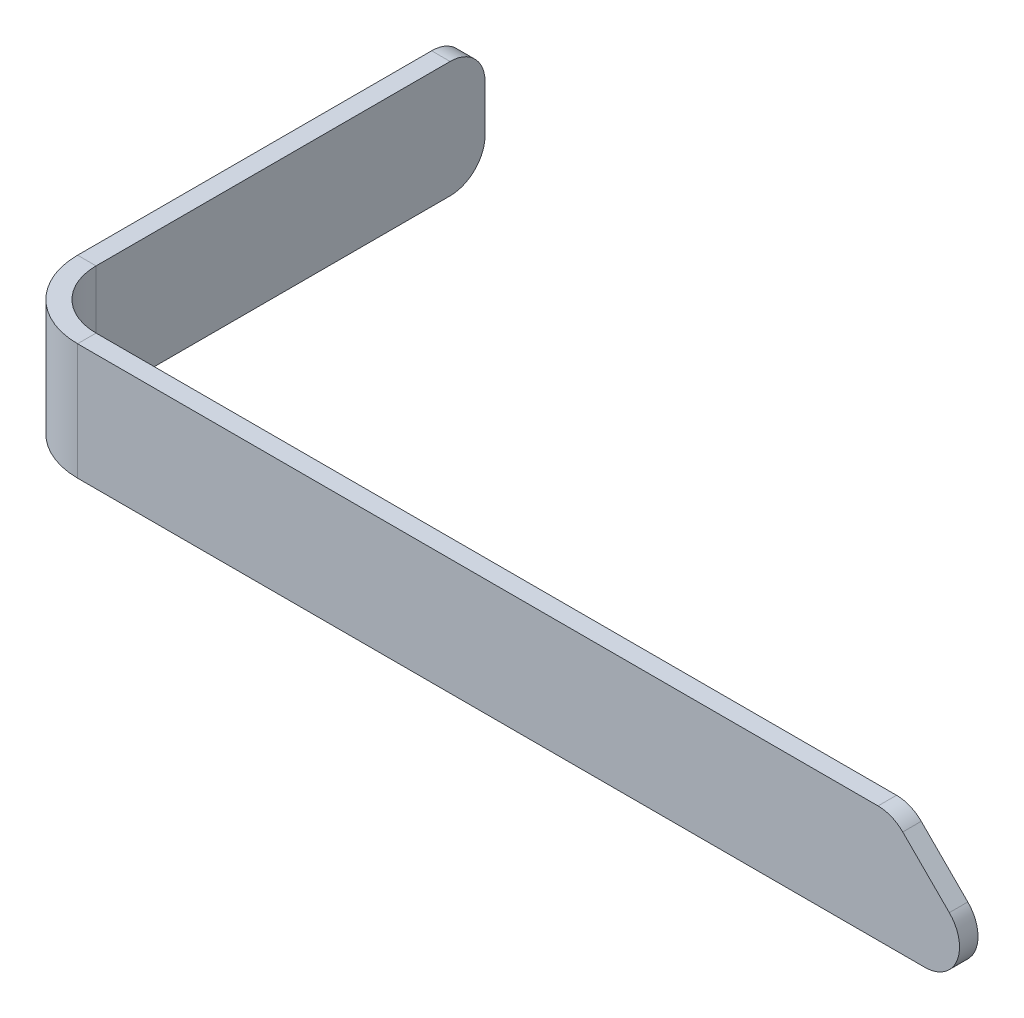
ISO-10303-21;
HEADER;
FILE_DESCRIPTION(('STEP AP214'),'2;1');
FILE_NAME('part.step','',(''),(''),'','','');
FILE_SCHEMA(('AUTOMOTIVE_DESIGN { 1 0 10303 214 1 1 1 1 }'));
ENDSEC;
DATA;
#1=APPLICATION_CONTEXT('core data for automotive mechanical design processes');
#2=APPLICATION_PROTOCOL_DEFINITION('international standard','automotive_design',2000,#1);
#3=PRODUCT_CONTEXT('',#1,'mechanical');
#4=PRODUCT('Part','Part','',(#3));
#5=PRODUCT_RELATED_PRODUCT_CATEGORY('part','',(#4));
#6=PRODUCT_DEFINITION_FORMATION('','',#4);
#7=PRODUCT_DEFINITION_CONTEXT('part definition',#1,'design');
#8=PRODUCT_DEFINITION('design','',#6,#7);
#9=PRODUCT_DEFINITION_SHAPE('','',#8);
#10=(LENGTH_UNIT() NAMED_UNIT(*) SI_UNIT(.MILLI.,.METRE.));
#11=(NAMED_UNIT(*) PLANE_ANGLE_UNIT() SI_UNIT($,.RADIAN.));
#12=(NAMED_UNIT(*) SI_UNIT($,.STERADIAN.) SOLID_ANGLE_UNIT());
#13=UNCERTAINTY_MEASURE_WITH_UNIT(LENGTH_MEASURE(1.E-05),#10,'distance_accuracy_value','');
#14=(GEOMETRIC_REPRESENTATION_CONTEXT(3) GLOBAL_UNCERTAINTY_ASSIGNED_CONTEXT((#13)) GLOBAL_UNIT_ASSIGNED_CONTEXT((#10,
#11,#12)) REPRESENTATION_CONTEXT('',''));
#15=CARTESIAN_POINT('',(0.,0.,0.));
#16=DIRECTION('',(0.,0.,1.));
#17=DIRECTION('',(1.,0.,0.));
#18=AXIS2_PLACEMENT_3D('',#15,#16,#17);
#19=CARTESIAN_POINT('',(-42.5,5.,1.6));
#20=DIRECTION('',(0.,-1.,0.));
#21=DIRECTION('',(-1.,0.,0.));
#22=AXIS2_PLACEMENT_3D('',#19,#20,#21);
#23=PLANE('',#22);
#24=DIRECTION('',(-1.,0.,0.));
#25=VECTOR('',#24,1.);
#26=CARTESIAN_POINT('',(-42.5,5.,1.6));
#27=LINE('',#26,#25);
#28=CARTESIAN_POINT('',(31.2573593128806,5.,1.6));
#29=VERTEX_POINT('',#28);
#30=CARTESIAN_POINT('',(-37.5,5.,1.59999999999999));
#31=VERTEX_POINT('',#30);
#32=EDGE_CURVE('E205',#29,#31,#27,.T.);
#33=ORIENTED_EDGE('',*,*,#32,.F.);
#34=DIRECTION('',(0.,0.,-1.));
#35=VECTOR('',#34,1.);
#36=CARTESIAN_POINT('',(31.2573593128806,5.,1.6));
#37=LINE('',#36,#35);
#38=CARTESIAN_POINT('',(31.2573593128806,5.,0.0125000000000001));
#39=VERTEX_POINT('',#38);
#40=EDGE_CURVE('E11',#29,#39,#37,.T.);
#41=ORIENTED_EDGE('',*,*,#40,.T.);
#42=DIRECTION('',(-1.,0.,0.));
#43=VECTOR('',#42,1.);
#44=CARTESIAN_POINT('',(0.,5.,0.0125000000000001));
#45=LINE('',#44,#43);
#46=CARTESIAN_POINT('',(-37.5,5.,0.0125000000000001));
#47=VERTEX_POINT('',#46);
#48=EDGE_CURVE('E202',#39,#47,#45,.T.);
#49=ORIENTED_EDGE('',*,*,#48,.T.);
#50=DIRECTION('',(0.,0.,1.));
#51=VECTOR('',#50,1.);
#52=CARTESIAN_POINT('',(-37.5,5.,0.0124999999999882));
#53=LINE('',#52,#51);
#54=EDGE_CURVE('E184',#47,#31,#53,.T.);
#55=ORIENTED_EDGE('',*,*,#54,.T.);
#56=EDGE_LOOP('',(#33,#41,#49,#55));
#57=FACE_BOUND('',#56,.T.);
#58=ADVANCED_FACE('F43',(#57),#23,.F.);
#59=CARTESIAN_POINT('',(0.,0.,1.6));
#60=DIRECTION('',(0.,0.,-1.));
#61=DIRECTION('',(-1.,0.,0.));
#62=AXIS2_PLACEMENT_3D('',#59,#60,#61);
#63=PLANE('',#62);
#64=DIRECTION('',(1.,0.,0.));
#65=VECTOR('',#64,1.);
#66=CARTESIAN_POINT('',(-42.5,-5.,1.6));
#67=LINE('',#66,#65);
#68=CARTESIAN_POINT('',(-37.5,-5.,1.6));
#69=VERTEX_POINT('',#68);
#70=CARTESIAN_POINT('',(35.2573593128807,-5.,1.6));
#71=VERTEX_POINT('',#70);
#72=EDGE_CURVE('E198',#69,#71,#67,.T.);
#73=ORIENTED_EDGE('',*,*,#72,.T.);
#74=CARTESIAN_POINT('',(35.2573593128807,-2.,1.6));
#75=DIRECTION('',(0.,0.,-1.));
#76=DIRECTION('',(-1.,0.,0.));
#77=AXIS2_PLACEMENT_3D('',#74,#75,#76);
#78=CIRCLE('',#77,3.);
#79=CARTESIAN_POINT('',(37.3786796564403,0.121320343559654,1.6));
#80=VERTEX_POINT('',#79);
#81=EDGE_CURVE('E234',#71,#80,#78,.F.);
#82=ORIENTED_EDGE('',*,*,#81,.T.);
#83=DIRECTION('',(-0.707106781186551,0.707106781186544,0.));
#84=VECTOR('',#83,1.);
#85=CARTESIAN_POINT('',(18.7499999999998,18.75,1.6));
#86=LINE('',#85,#84);
#87=CARTESIAN_POINT('',(33.3786796564402,4.12132034355966,1.6));
#88=VERTEX_POINT('',#87);
#89=EDGE_CURVE('E201',#80,#88,#86,.T.);
#90=ORIENTED_EDGE('',*,*,#89,.T.);
#91=CARTESIAN_POINT('',(31.2573593128806,2.,1.6));
#92=DIRECTION('',(0.,0.,-1.));
#93=DIRECTION('',(-1.,0.,0.));
#94=AXIS2_PLACEMENT_3D('',#91,#92,#93);
#95=CIRCLE('',#94,3.);
#96=EDGE_CURVE('E232',#88,#29,#95,.F.);
#97=ORIENTED_EDGE('',*,*,#96,.T.);
#98=ORIENTED_EDGE('',*,*,#32,.T.);
#99=DIRECTION('',(0.,1.,0.));
#100=VECTOR('',#99,1.);
#101=CARTESIAN_POINT('',(-37.5,5.,1.59999999999999));
#102=LINE('',#101,#100);
#103=EDGE_CURVE('E140',#31,#69,#102,.F.);
#104=ORIENTED_EDGE('',*,*,#103,.T.);
#105=EDGE_LOOP('',(#73,#82,#90,#97,#98,#104));
#106=FACE_BOUND('',#105,.T.);
#107=ADVANCED_FACE('F254',(#106),#63,.F.);
#108=CARTESIAN_POINT('',(0.,0.,0.0125000000000001));
#109=DIRECTION('',(0.,0.,-1.));
#110=DIRECTION('',(-1.,0.,0.));
#111=AXIS2_PLACEMENT_3D('',#108,#109,#110);
#112=PLANE('',#111);
#113=DIRECTION('',(-0.707106781186551,0.707106781186544,0.));
#114=VECTOR('',#113,1.);
#115=CARTESIAN_POINT('',(18.7499999999998,18.75,0.0125000000000001));
#116=LINE('',#115,#114);
#117=CARTESIAN_POINT('',(37.3786796564403,0.121320343559654,0.0125000000000001));
#118=VERTEX_POINT('',#117);
#119=CARTESIAN_POINT('',(33.3786796564402,4.12132034355966,0.0125000000000001));
#120=VERTEX_POINT('',#119);
#121=EDGE_CURVE('E210',#118,#120,#116,.T.);
#122=ORIENTED_EDGE('',*,*,#121,.F.);
#123=CARTESIAN_POINT('',(35.2573593128807,-2.,0.0125000000000001));
#124=DIRECTION('',(0.,0.,-1.));
#125=DIRECTION('',(-1.,0.,0.));
#126=AXIS2_PLACEMENT_3D('',#123,#124,#125);
#127=CIRCLE('',#126,3.);
#128=CARTESIAN_POINT('',(35.2573593128807,-5.,0.0125000000000001));
#129=VERTEX_POINT('',#128);
#130=EDGE_CURVE('E51',#118,#129,#127,.T.);
#131=ORIENTED_EDGE('',*,*,#130,.T.);
#132=DIRECTION('',(-1.,0.,0.));
#133=VECTOR('',#132,1.);
#134=CARTESIAN_POINT('',(0.,-5.,0.0125000000000001));
#135=LINE('',#134,#133);
#136=CARTESIAN_POINT('',(-37.5,-5.,0.0124999999999882));
#137=VERTEX_POINT('',#136);
#138=EDGE_CURVE('E195',#137,#129,#135,.F.);
#139=ORIENTED_EDGE('',*,*,#138,.F.);
#140=DIRECTION('',(0.,1.,0.));
#141=VECTOR('',#140,1.);
#142=CARTESIAN_POINT('',(-37.5,5.,0.0124999999999882));
#143=LINE('',#142,#141);
#144=EDGE_CURVE('E188',#47,#137,#143,.F.);
#145=ORIENTED_EDGE('',*,*,#144,.F.);
#146=ORIENTED_EDGE('',*,*,#48,.F.);
#147=CARTESIAN_POINT('',(31.2573593128806,2.,0.0125000000000001));
#148=DIRECTION('',(0.,0.,-1.));
#149=DIRECTION('',(-1.,0.,0.));
#150=AXIS2_PLACEMENT_3D('',#147,#148,#149);
#151=CIRCLE('',#150,3.);
#152=EDGE_CURVE('E63',#39,#120,#151,.T.);
#153=ORIENTED_EDGE('',*,*,#152,.T.);
#154=EDGE_LOOP('',(#122,#131,#139,#145,#146,#153));
#155=FACE_BOUND('',#154,.T.);
#156=ADVANCED_FACE('F243',(#155),#112,.T.);
#157=CARTESIAN_POINT('',(-42.5,-5.,1.6));
#158=DIRECTION('',(0.,1.,0.));
#159=DIRECTION('',(1.,0.,0.));
#160=AXIS2_PLACEMENT_3D('',#157,#158,#159);
#161=PLANE('',#160);
#162=ORIENTED_EDGE('',*,*,#138,.T.);
#163=DIRECTION('',(0.,0.,-1.));
#164=VECTOR('',#163,1.);
#165=CARTESIAN_POINT('',(35.2573593128807,-5.,1.6));
#166=LINE('',#165,#164);
#167=EDGE_CURVE('E229',#129,#71,#166,.F.);
#168=ORIENTED_EDGE('',*,*,#167,.T.);
#169=ORIENTED_EDGE('',*,*,#72,.F.);
#170=DIRECTION('',(0.,0.,1.));
#171=VECTOR('',#170,1.);
#172=CARTESIAN_POINT('',(-37.5,-5.,0.0124999999999882));
#173=LINE('',#172,#171);
#174=EDGE_CURVE('E192',#137,#69,#173,.T.);
#175=ORIENTED_EDGE('',*,*,#174,.F.);
#176=EDGE_LOOP('',(#162,#168,#169,#175));
#177=FACE_BOUND('',#176,.T.);
#178=ADVANCED_FACE('F249',(#177),#161,.F.);
#179=CARTESIAN_POINT('',(18.7499999999998,18.75,1.6));
#180=DIRECTION('',(-0.707106781186544,-0.707106781186551,0.));
#181=DIRECTION('',(-0.707106781186551,0.707106781186544,0.));
#182=AXIS2_PLACEMENT_3D('',#179,#180,#181);
#183=PLANE('',#182);
#184=ORIENTED_EDGE('',*,*,#89,.F.);
#185=DIRECTION('',(0.,0.,-1.));
#186=VECTOR('',#185,1.);
#187=CARTESIAN_POINT('',(37.3786796564403,0.121320343559654,1.6));
#188=LINE('',#187,#186);
#189=EDGE_CURVE('E239',#80,#118,#188,.T.);
#190=ORIENTED_EDGE('',*,*,#189,.T.);
#191=ORIENTED_EDGE('',*,*,#121,.T.);
#192=DIRECTION('',(0.,0.,-1.));
#193=VECTOR('',#192,1.);
#194=CARTESIAN_POINT('',(33.3786796564402,4.12132034355966,1.6));
#195=LINE('',#194,#193);
#196=EDGE_CURVE('E236',#120,#88,#195,.F.);
#197=ORIENTED_EDGE('',*,*,#196,.T.);
#198=EDGE_LOOP('',(#184,#190,#191,#197));
#199=FACE_BOUND('',#198,.T.);
#200=ADVANCED_FACE('F256',(#199),#183,.F.);
#201=CARTESIAN_POINT('',(-37.5,-5.,-4.9875));
#202=DIRECTION('',(0.,-1.,0.));
#203=DIRECTION('',(0.,0.,-1.));
#204=AXIS2_PLACEMENT_3D('',#201,#202,#203);
#205=PLANE('',#204);
#206=DIRECTION('',(-1.,0.,0.));
#207=VECTOR('',#206,1.);
#208=CARTESIAN_POINT('',(-42.5,-5.,-4.98749999999998));
#209=LINE('',#208,#207);
#210=CARTESIAN_POINT('',(-42.5,-5.,-4.98749999999998));
#211=VERTEX_POINT('',#210);
#212=CARTESIAN_POINT('',(-44.0875,-5.,-4.98749999999998));
#213=VERTEX_POINT('',#212);
#214=EDGE_CURVE('E265',#211,#213,#209,.T.);
#215=ORIENTED_EDGE('',*,*,#214,.F.);
#216=CARTESIAN_POINT('',(-37.5,-5.,-4.9875));
#217=DIRECTION('',(0.,1.,0.));
#218=DIRECTION('',(0.,0.,1.));
#219=AXIS2_PLACEMENT_3D('',#216,#217,#218);
#220=CIRCLE('',#219,4.99999999999999);
#221=EDGE_CURVE('E143',#137,#211,#220,.F.);
#222=ORIENTED_EDGE('',*,*,#221,.F.);
#223=ORIENTED_EDGE('',*,*,#174,.T.);
#224=CARTESIAN_POINT('',(-37.5,-5.,-4.9875));
#225=DIRECTION('',(0.,1.,0.));
#226=DIRECTION('',(0.,0.,1.));
#227=AXIS2_PLACEMENT_3D('',#224,#225,#226);
#228=CIRCLE('',#227,6.58749999999999);
#229=EDGE_CURVE('E183',#69,#213,#228,.F.);
#230=ORIENTED_EDGE('',*,*,#229,.T.);
#231=EDGE_LOOP('',(#215,#222,#223,#230));
#232=FACE_BOUND('',#231,.T.);
#233=ADVANCED_FACE('F273',(#232),#205,.T.);
#234=CARTESIAN_POINT('',(-37.5,5.,-4.9875));
#235=DIRECTION('',(0.,-1.,0.));
#236=DIRECTION('',(0.,0.,-1.));
#237=AXIS2_PLACEMENT_3D('',#234,#235,#236);
#238=PLANE('',#237);
#239=CARTESIAN_POINT('',(-37.5,5.,-4.9875));
#240=DIRECTION('',(0.,1.,0.));
#241=DIRECTION('',(0.,0.,1.));
#242=AXIS2_PLACEMENT_3D('',#239,#240,#241);
#243=CIRCLE('',#242,4.99999999999999);
#244=CARTESIAN_POINT('',(-42.5,5.,-4.98749999999998));
#245=VERTEX_POINT('',#244);
#246=EDGE_CURVE('E150',#245,#47,#243,.T.);
#247=ORIENTED_EDGE('',*,*,#246,.F.);
#248=DIRECTION('',(-1.,0.,0.));
#249=VECTOR('',#248,1.);
#250=CARTESIAN_POINT('',(-42.5,5.,-4.98749999999998));
#251=LINE('',#250,#249);
#252=CARTESIAN_POINT('',(-44.0875,5.,-4.98749999999998));
#253=VERTEX_POINT('',#252);
#254=EDGE_CURVE('E147',#245,#253,#251,.T.);
#255=ORIENTED_EDGE('',*,*,#254,.T.);
#256=CARTESIAN_POINT('',(-37.5,5.,-4.9875));
#257=DIRECTION('',(0.,1.,0.));
#258=DIRECTION('',(0.,0.,1.));
#259=AXIS2_PLACEMENT_3D('',#256,#257,#258);
#260=CIRCLE('',#259,6.58749999999999);
#261=EDGE_CURVE('E133',#253,#31,#260,.T.);
#262=ORIENTED_EDGE('',*,*,#261,.T.);
#263=ORIENTED_EDGE('',*,*,#54,.F.);
#264=EDGE_LOOP('',(#247,#255,#262,#263));
#265=FACE_BOUND('',#264,.T.);
#266=ADVANCED_FACE('F148',(#265),#238,.F.);
#267=CARTESIAN_POINT('',(-37.5,5.,-4.9875));
#268=DIRECTION('',(0.,1.,0.));
#269=DIRECTION('',(-1.,0.,0.));
#270=AXIS2_PLACEMENT_3D('',#267,#268,#269);
#271=CYLINDRICAL_SURFACE('',#270,6.58749999999999);
#272=ORIENTED_EDGE('',*,*,#103,.F.);
#273=ORIENTED_EDGE('',*,*,#261,.F.);
#274=DIRECTION('',(0.,-1.,0.));
#275=VECTOR('',#274,1.);
#276=CARTESIAN_POINT('',(-44.0875,0.,-4.98749999999998));
#277=LINE('',#276,#275);
#278=EDGE_CURVE('E138',#253,#213,#277,.T.);
#279=ORIENTED_EDGE('',*,*,#278,.T.);
#280=ORIENTED_EDGE('',*,*,#229,.F.);
#281=EDGE_LOOP('',(#272,#273,#279,#280));
#282=FACE_BOUND('',#281,.T.);
#283=ADVANCED_FACE('F135',(#282),#271,.T.);
#284=CARTESIAN_POINT('',(-37.5,5.,-4.9875));
#285=DIRECTION('',(0.,1.,0.));
#286=DIRECTION('',(-1.,0.,0.));
#287=AXIS2_PLACEMENT_3D('',#284,#285,#286);
#288=CYLINDRICAL_SURFACE('',#287,4.99999999999999);
#289=ORIENTED_EDGE('',*,*,#144,.T.);
#290=ORIENTED_EDGE('',*,*,#221,.T.);
#291=DIRECTION('',(0.,1.,0.));
#292=VECTOR('',#291,1.);
#293=CARTESIAN_POINT('',(-42.5,-5.,-4.98749999999998));
#294=LINE('',#293,#292);
#295=EDGE_CURVE('E155',#211,#245,#294,.T.);
#296=ORIENTED_EDGE('',*,*,#295,.T.);
#297=ORIENTED_EDGE('',*,*,#246,.T.);
#298=EDGE_LOOP('',(#289,#290,#296,#297));
#299=FACE_BOUND('',#298,.T.);
#300=ADVANCED_FACE('F260',(#299),#288,.F.);
#301=CARTESIAN_POINT('',(-44.0875000000001,5.,-38.4));
#302=DIRECTION('',(0.,-1.,0.));
#303=DIRECTION('',(0.,0.,-1.));
#304=AXIS2_PLACEMENT_3D('',#301,#302,#303);
#305=PLANE('',#304);
#306=DIRECTION('',(0.,0.,-1.));
#307=VECTOR('',#306,1.);
#308=CARTESIAN_POINT('',(-42.5000000000001,5.,-38.4));
#309=LINE('',#308,#307);
#310=CARTESIAN_POINT('',(-42.5000000000001,5.,-35.4));
#311=VERTEX_POINT('',#310);
#312=EDGE_CURVE('E165',#245,#311,#309,.T.);
#313=ORIENTED_EDGE('',*,*,#312,.T.);
#314=DIRECTION('',(1.,0.,0.));
#315=VECTOR('',#314,1.);
#316=CARTESIAN_POINT('',(-44.0875000000001,5.,-35.4));
#317=LINE('',#316,#315);
#318=CARTESIAN_POINT('',(-44.0875000000001,5.,-35.4));
#319=VERTEX_POINT('',#318);
#320=EDGE_CURVE('E169',#311,#319,#317,.F.);
#321=ORIENTED_EDGE('',*,*,#320,.T.);
#322=DIRECTION('',(0.,0.,-1.));
#323=VECTOR('',#322,1.);
#324=CARTESIAN_POINT('',(-44.0875000000001,5.,-38.4));
#325=LINE('',#324,#323);
#326=EDGE_CURVE('E161',#253,#319,#325,.T.);
#327=ORIENTED_EDGE('',*,*,#326,.F.);
#328=ORIENTED_EDGE('',*,*,#254,.F.);
#329=EDGE_LOOP('',(#313,#321,#327,#328));
#330=FACE_BOUND('',#329,.T.);
#331=ADVANCED_FACE('F167',(#330),#305,.F.);
#332=CARTESIAN_POINT('',(-44.0875,-5.,0.0125000000000057));
#333=DIRECTION('',(0.,1.,0.));
#334=DIRECTION('',(0.,0.,1.));
#335=AXIS2_PLACEMENT_3D('',#332,#333,#334);
#336=PLANE('',#335);
#337=DIRECTION('',(0.,0.,1.));
#338=VECTOR('',#337,1.);
#339=CARTESIAN_POINT('',(-44.0875,-5.,0.0125000000000057));
#340=LINE('',#339,#338);
#341=CARTESIAN_POINT('',(-44.0875000000001,-5.,-35.4));
#342=VERTEX_POINT('',#341);
#343=EDGE_CURVE('E164',#342,#213,#340,.T.);
#344=ORIENTED_EDGE('',*,*,#343,.F.);
#345=DIRECTION('',(1.,0.,0.));
#346=VECTOR('',#345,1.);
#347=CARTESIAN_POINT('',(-44.0875000000001,-5.,-35.4));
#348=LINE('',#347,#346);
#349=CARTESIAN_POINT('',(-42.5000000000001,-5.,-35.4));
#350=VERTEX_POINT('',#349);
#351=EDGE_CURVE('E207',#342,#350,#348,.T.);
#352=ORIENTED_EDGE('',*,*,#351,.T.);
#353=DIRECTION('',(0.,0.,1.));
#354=VECTOR('',#353,1.);
#355=CARTESIAN_POINT('',(-42.5,-5.,0.0125000000000001));
#356=LINE('',#355,#354);
#357=EDGE_CURVE('E171',#350,#211,#356,.T.);
#358=ORIENTED_EDGE('',*,*,#357,.T.);
#359=ORIENTED_EDGE('',*,*,#214,.T.);
#360=EDGE_LOOP('',(#344,#352,#358,#359));
#361=FACE_BOUND('',#360,.T.);
#362=ADVANCED_FACE('F270',(#361),#336,.F.);
#363=CARTESIAN_POINT('',(-44.0875,0.,1.51410785913538E-13));
#364=DIRECTION('',(1.,0.,0.));
#365=DIRECTION('',(0.,0.,-1.));
#366=AXIS2_PLACEMENT_3D('',#363,#364,#365);
#367=PLANE('',#366);
#368=DIRECTION('',(0.,-1.,0.));
#369=VECTOR('',#368,1.);
#370=CARTESIAN_POINT('',(-44.0875000000001,-5.,-38.4));
#371=LINE('',#370,#369);
#372=CARTESIAN_POINT('',(-44.0875000000001,2.,-38.4));
#373=VERTEX_POINT('',#372);
#374=CARTESIAN_POINT('',(-44.0875000000001,-2.,-38.4));
#375=VERTEX_POINT('',#374);
#376=EDGE_CURVE('E170',#373,#375,#371,.T.);
#377=ORIENTED_EDGE('',*,*,#376,.T.);
#378=CARTESIAN_POINT('',(-44.0875000000001,-2.,-35.4));
#379=DIRECTION('',(1.,0.,0.));
#380=DIRECTION('',(0.,0.,-1.));
#381=AXIS2_PLACEMENT_3D('',#378,#379,#380);
#382=CIRCLE('',#381,3.);
#383=EDGE_CURVE('E226',#375,#342,#382,.F.);
#384=ORIENTED_EDGE('',*,*,#383,.T.);
#385=ORIENTED_EDGE('',*,*,#343,.T.);
#386=ORIENTED_EDGE('',*,*,#278,.F.);
#387=ORIENTED_EDGE('',*,*,#326,.T.);
#388=CARTESIAN_POINT('',(-44.0875000000001,2.,-35.4));
#389=DIRECTION('',(1.,0.,0.));
#390=DIRECTION('',(0.,0.,-1.));
#391=AXIS2_PLACEMENT_3D('',#388,#389,#390);
#392=CIRCLE('',#391,3.);
#393=EDGE_CURVE('E224',#319,#373,#392,.F.);
#394=ORIENTED_EDGE('',*,*,#393,.T.);
#395=EDGE_LOOP('',(#377,#384,#385,#386,#387,#394));
#396=FACE_BOUND('',#395,.T.);
#397=ADVANCED_FACE('F160',(#396),#367,.F.);
#398=CARTESIAN_POINT('',(-42.5,0.,1.45868059288125E-13));
#399=DIRECTION('',(1.,0.,0.));
#400=DIRECTION('',(0.,0.,-1.));
#401=AXIS2_PLACEMENT_3D('',#398,#399,#400);
#402=PLANE('',#401);
#403=ORIENTED_EDGE('',*,*,#357,.F.);
#404=CARTESIAN_POINT('',(-42.5000000000001,-2.,-35.4));
#405=DIRECTION('',(1.,0.,0.));
#406=DIRECTION('',(0.,0.,-1.));
#407=AXIS2_PLACEMENT_3D('',#404,#405,#406);
#408=CIRCLE('',#407,3.);
#409=CARTESIAN_POINT('',(-42.5000000000001,-2.,-38.4));
#410=VERTEX_POINT('',#409);
#411=EDGE_CURVE('E217',#350,#410,#408,.T.);
#412=ORIENTED_EDGE('',*,*,#411,.T.);
#413=DIRECTION('',(0.,-1.,0.));
#414=VECTOR('',#413,1.);
#415=CARTESIAN_POINT('',(-42.5000000000001,-5.,-38.4));
#416=LINE('',#415,#414);
#417=CARTESIAN_POINT('',(-42.5000000000001,2.,-38.4));
#418=VERTEX_POINT('',#417);
#419=EDGE_CURVE('E174',#418,#410,#416,.T.);
#420=ORIENTED_EDGE('',*,*,#419,.F.);
#421=CARTESIAN_POINT('',(-42.5000000000001,2.,-35.4));
#422=DIRECTION('',(1.,0.,0.));
#423=DIRECTION('',(0.,0.,-1.));
#424=AXIS2_PLACEMENT_3D('',#421,#422,#423);
#425=CIRCLE('',#424,3.);
#426=EDGE_CURVE('E215',#418,#311,#425,.T.);
#427=ORIENTED_EDGE('',*,*,#426,.T.);
#428=ORIENTED_EDGE('',*,*,#312,.F.);
#429=ORIENTED_EDGE('',*,*,#295,.F.);
#430=EDGE_LOOP('',(#403,#412,#420,#427,#428,#429));
#431=FACE_BOUND('',#430,.T.);
#432=ADVANCED_FACE('F335',(#431),#402,.T.);
#433=CARTESIAN_POINT('',(-44.0875000000001,-5.,-38.4));
#434=DIRECTION('',(0.,0.,1.));
#435=DIRECTION('',(1.,0.,0.));
#436=AXIS2_PLACEMENT_3D('',#433,#434,#435);
#437=PLANE('',#436);
#438=ORIENTED_EDGE('',*,*,#419,.T.);
#439=DIRECTION('',(1.,0.,0.));
#440=VECTOR('',#439,1.);
#441=CARTESIAN_POINT('',(-44.0875000000001,-2.,-38.4));
#442=LINE('',#441,#440);
#443=EDGE_CURVE('E222',#410,#375,#442,.F.);
#444=ORIENTED_EDGE('',*,*,#443,.T.);
#445=ORIENTED_EDGE('',*,*,#376,.F.);
#446=DIRECTION('',(1.,0.,0.));
#447=VECTOR('',#446,1.);
#448=CARTESIAN_POINT('',(-44.0875000000001,2.,-38.4));
#449=LINE('',#448,#447);
#450=EDGE_CURVE('E219',#373,#418,#449,.T.);
#451=ORIENTED_EDGE('',*,*,#450,.T.);
#452=EDGE_LOOP('',(#438,#444,#445,#451));
#453=FACE_BOUND('',#452,.T.);
#454=ADVANCED_FACE('F296',(#453),#437,.F.);
#455=CARTESIAN_POINT('',(-44.0875000000001,-2.,-35.4));
#456=DIRECTION('',(1.,0.,0.));
#457=DIRECTION('',(0.,0.,-1.));
#458=AXIS2_PLACEMENT_3D('',#455,#456,#457);
#459=CYLINDRICAL_SURFACE('',#458,3.);
#460=ORIENTED_EDGE('',*,*,#383,.F.);
#461=ORIENTED_EDGE('',*,*,#443,.F.);
#462=ORIENTED_EDGE('',*,*,#411,.F.);
#463=ORIENTED_EDGE('',*,*,#351,.F.);
#464=EDGE_LOOP('',(#460,#461,#462,#463));
#465=FACE_BOUND('',#464,.T.);
#466=ADVANCED_FACE('F292',(#465),#459,.T.);
#467=CARTESIAN_POINT('',(-44.0875000000001,2.,-35.4));
#468=DIRECTION('',(1.,0.,0.));
#469=DIRECTION('',(0.,0.,-1.));
#470=AXIS2_PLACEMENT_3D('',#467,#468,#469);
#471=CYLINDRICAL_SURFACE('',#470,3.);
#472=ORIENTED_EDGE('',*,*,#393,.F.);
#473=ORIENTED_EDGE('',*,*,#320,.F.);
#474=ORIENTED_EDGE('',*,*,#426,.F.);
#475=ORIENTED_EDGE('',*,*,#450,.F.);
#476=EDGE_LOOP('',(#472,#473,#474,#475));
#477=FACE_BOUND('',#476,.T.);
#478=ADVANCED_FACE('F295',(#477),#471,.T.);
#479=CARTESIAN_POINT('',(35.2573593128807,-2.,1.6));
#480=DIRECTION('',(0.,0.,1.));
#481=DIRECTION('',(1.,0.,0.));
#482=AXIS2_PLACEMENT_3D('',#479,#480,#481);
#483=CYLINDRICAL_SURFACE('',#482,3.);
#484=ORIENTED_EDGE('',*,*,#130,.F.);
#485=ORIENTED_EDGE('',*,*,#189,.F.);
#486=ORIENTED_EDGE('',*,*,#81,.F.);
#487=ORIENTED_EDGE('',*,*,#167,.F.);
#488=EDGE_LOOP('',(#484,#485,#486,#487));
#489=FACE_BOUND('',#488,.T.);
#490=ADVANCED_FACE('F251',(#489),#483,.T.);
#491=CARTESIAN_POINT('',(31.2573593128806,2.,1.6));
#492=DIRECTION('',(0.,0.,1.));
#493=DIRECTION('',(1.,0.,0.));
#494=AXIS2_PLACEMENT_3D('',#491,#492,#493);
#495=CYLINDRICAL_SURFACE('',#494,3.);
#496=ORIENTED_EDGE('',*,*,#152,.F.);
#497=ORIENTED_EDGE('',*,*,#40,.F.);
#498=ORIENTED_EDGE('',*,*,#96,.F.);
#499=ORIENTED_EDGE('',*,*,#196,.F.);
#500=EDGE_LOOP('',(#496,#497,#498,#499));
#501=FACE_BOUND('',#500,.T.);
#502=ADVANCED_FACE('F45',(#501),#495,.T.);
#503=CLOSED_SHELL('',(#58,#107,#156,#178,#200,#233,#266,#283,#300,#331,#362,#397,#432,#454,#466,
#478,#490,#502));
#504=MANIFOLD_SOLID_BREP('B2',#503);
#505=ADVANCED_BREP_SHAPE_REPRESENTATION('',(#18,#504),#14);
#506=SHAPE_DEFINITION_REPRESENTATION(#9,#505);
ENDSEC;
END-ISO-10303-21;
